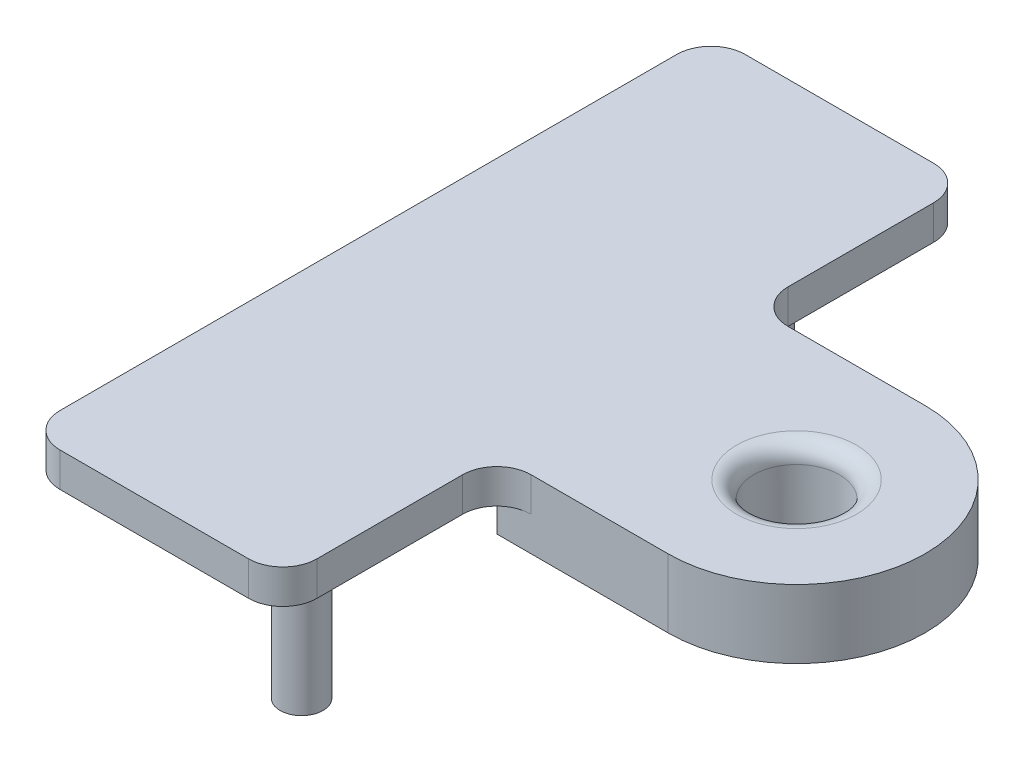
ISO-10303-21;
HEADER;
FILE_DESCRIPTION(('STEP AP214'),'2;1');
FILE_NAME('part.step','',(''),(''),'','','');
FILE_SCHEMA(('AUTOMOTIVE_DESIGN { 1 0 10303 214 1 1 1 1 }'));
ENDSEC;
DATA;
#1=APPLICATION_CONTEXT('core data for automotive mechanical design processes');
#2=APPLICATION_PROTOCOL_DEFINITION('international standard','automotive_design',2000,#1);
#3=PRODUCT_CONTEXT('',#1,'mechanical');
#4=PRODUCT('Part','Part','',(#3));
#5=PRODUCT_RELATED_PRODUCT_CATEGORY('part','',(#4));
#6=PRODUCT_DEFINITION_FORMATION('','',#4);
#7=PRODUCT_DEFINITION_CONTEXT('part definition',#1,'design');
#8=PRODUCT_DEFINITION('design','',#6,#7);
#9=PRODUCT_DEFINITION_SHAPE('','',#8);
#10=(LENGTH_UNIT() NAMED_UNIT(*) SI_UNIT(.MILLI.,.METRE.));
#11=(NAMED_UNIT(*) PLANE_ANGLE_UNIT() SI_UNIT($,.RADIAN.));
#12=(NAMED_UNIT(*) SI_UNIT($,.STERADIAN.) SOLID_ANGLE_UNIT());
#13=UNCERTAINTY_MEASURE_WITH_UNIT(LENGTH_MEASURE(1.E-05),#10,'distance_accuracy_value','');
#14=(GEOMETRIC_REPRESENTATION_CONTEXT(3) GLOBAL_UNCERTAINTY_ASSIGNED_CONTEXT((#13)) GLOBAL_UNIT_ASSIGNED_CONTEXT((#10,
#11,#12)) REPRESENTATION_CONTEXT('',''));
#15=CARTESIAN_POINT('',(0.,0.,0.));
#16=DIRECTION('',(0.,0.,1.));
#17=DIRECTION('',(1.,0.,0.));
#18=AXIS2_PLACEMENT_3D('',#15,#16,#17);
#19=CARTESIAN_POINT('',(7.5,2.,20.));
#20=DIRECTION('',(-1.,0.,0.));
#21=DIRECTION('',(0.,0.,1.));
#22=AXIS2_PLACEMENT_3D('',#19,#20,#21);
#23=PLANE('',#22);
#24=DIRECTION('',(0.,0.,-1.));
#25=VECTOR('',#24,1.);
#26=CARTESIAN_POINT('',(7.5,0.,20.));
#27=LINE('',#26,#25);
#28=CARTESIAN_POINT('',(7.5,0.,-9.5));
#29=VERTEX_POINT('',#28);
#30=CARTESIAN_POINT('',(7.5,0.,-18.));
#31=VERTEX_POINT('',#30);
#32=EDGE_CURVE('E205',#29,#31,#27,.T.);
#33=ORIENTED_EDGE('',*,*,#32,.T.);
#34=DIRECTION('',(0.,-1.,0.));
#35=VECTOR('',#34,1.);
#36=CARTESIAN_POINT('',(7.5,2.,-18.));
#37=LINE('',#36,#35);
#38=CARTESIAN_POINT('',(7.5,2.,-18.));
#39=VERTEX_POINT('',#38);
#40=EDGE_CURVE('E294',#31,#39,#37,.F.);
#41=ORIENTED_EDGE('',*,*,#40,.T.);
#42=DIRECTION('',(0.,0.,-1.));
#43=VECTOR('',#42,1.);
#44=CARTESIAN_POINT('',(7.5,2.,20.));
#45=LINE('',#44,#43);
#46=CARTESIAN_POINT('',(7.5,2.,-9.5));
#47=VERTEX_POINT('',#46);
#48=EDGE_CURVE('E212',#47,#39,#45,.T.);
#49=ORIENTED_EDGE('',*,*,#48,.F.);
#50=DIRECTION('',(0.,1.,0.));
#51=VECTOR('',#50,1.);
#52=CARTESIAN_POINT('',(7.5,2.,-9.5));
#53=LINE('',#52,#51);
#54=EDGE_CURVE('E291',#47,#29,#53,.F.);
#55=ORIENTED_EDGE('',*,*,#54,.T.);
#56=EDGE_LOOP('',(#33,#41,#49,#55));
#57=FACE_BOUND('',#56,.T.);
#58=ADVANCED_FACE('F43',(#57),#23,.F.);
#59=CARTESIAN_POINT('',(7.5,0.,18.));
#60=VERTEX_POINT('',#59);
#61=CARTESIAN_POINT('',(7.5,0.,9.5));
#62=VERTEX_POINT('',#61);
#63=EDGE_CURVE('E234',#60,#62,#27,.T.);
#64=ORIENTED_EDGE('',*,*,#63,.T.);
#65=DIRECTION('',(0.,1.,0.));
#66=VECTOR('',#65,1.);
#67=CARTESIAN_POINT('',(7.5,2.,9.5));
#68=LINE('',#67,#66);
#69=CARTESIAN_POINT('',(7.5,2.,9.5));
#70=VERTEX_POINT('',#69);
#71=EDGE_CURVE('E301',#62,#70,#68,.T.);
#72=ORIENTED_EDGE('',*,*,#71,.T.);
#73=CARTESIAN_POINT('',(7.5,2.,18.));
#74=VERTEX_POINT('',#73);
#75=EDGE_CURVE('E216',#74,#70,#45,.T.);
#76=ORIENTED_EDGE('',*,*,#75,.F.);
#77=DIRECTION('',(0.,-1.,0.));
#78=VECTOR('',#77,1.);
#79=CARTESIAN_POINT('',(7.5,2.,18.));
#80=LINE('',#79,#78);
#81=EDGE_CURVE('E297',#74,#60,#80,.T.);
#82=ORIENTED_EDGE('',*,*,#81,.T.);
#83=EDGE_LOOP('',(#64,#72,#76,#82));
#84=FACE_BOUND('',#83,.T.);
#85=ADVANCED_FACE('F355',(#84),#23,.F.);
#86=CARTESIAN_POINT('',(-7.5,2.,-20.));
#87=DIRECTION('',(0.,0.,1.));
#88=DIRECTION('',(1.,0.,0.));
#89=AXIS2_PLACEMENT_3D('',#86,#87,#88);
#90=PLANE('',#89);
#91=DIRECTION('',(-1.,0.,0.));
#92=VECTOR('',#91,1.);
#93=CARTESIAN_POINT('',(-7.5,0.,-20.));
#94=LINE('',#93,#92);
#95=CARTESIAN_POINT('',(5.5,0.,-20.));
#96=VERTEX_POINT('',#95);
#97=CARTESIAN_POINT('',(-5.5,0.,-20.));
#98=VERTEX_POINT('',#97);
#99=EDGE_CURVE('E235',#96,#98,#94,.T.);
#100=ORIENTED_EDGE('',*,*,#99,.T.);
#101=DIRECTION('',(0.,-1.,0.));
#102=VECTOR('',#101,1.);
#103=CARTESIAN_POINT('',(-5.5,2.,-20.));
#104=LINE('',#103,#102);
#105=CARTESIAN_POINT('',(-5.5,2.,-20.));
#106=VERTEX_POINT('',#105);
#107=EDGE_CURVE('E276',#98,#106,#104,.F.);
#108=ORIENTED_EDGE('',*,*,#107,.T.);
#109=DIRECTION('',(-1.,0.,0.));
#110=VECTOR('',#109,1.);
#111=CARTESIAN_POINT('',(-7.5,2.,-20.));
#112=LINE('',#111,#110);
#113=CARTESIAN_POINT('',(5.5,2.,-20.));
#114=VERTEX_POINT('',#113);
#115=EDGE_CURVE('E218',#114,#106,#112,.T.);
#116=ORIENTED_EDGE('',*,*,#115,.F.);
#117=DIRECTION('',(0.,-1.,0.));
#118=VECTOR('',#117,1.);
#119=CARTESIAN_POINT('',(5.5,2.,-20.));
#120=LINE('',#119,#118);
#121=EDGE_CURVE('E272',#114,#96,#120,.T.);
#122=ORIENTED_EDGE('',*,*,#121,.T.);
#123=EDGE_LOOP('',(#100,#108,#116,#122));
#124=FACE_BOUND('',#123,.T.);
#125=ADVANCED_FACE('F386',(#124),#90,.F.);
#126=CARTESIAN_POINT('',(-7.5,2.,20.));
#127=DIRECTION('',(1.,0.,0.));
#128=DIRECTION('',(0.,0.,-1.));
#129=AXIS2_PLACEMENT_3D('',#126,#127,#128);
#130=PLANE('',#129);
#131=DIRECTION('',(0.,0.,1.));
#132=VECTOR('',#131,1.);
#133=CARTESIAN_POINT('',(-7.5,2.,20.));
#134=LINE('',#133,#132);
#135=CARTESIAN_POINT('',(-7.5,2.,-18.));
#136=VERTEX_POINT('',#135);
#137=CARTESIAN_POINT('',(-7.5,2.,18.));
#138=VERTEX_POINT('',#137);
#139=EDGE_CURVE('E222',#136,#138,#134,.T.);
#140=ORIENTED_EDGE('',*,*,#139,.F.);
#141=DIRECTION('',(0.,-1.,0.));
#142=VECTOR('',#141,1.);
#143=CARTESIAN_POINT('',(-7.5,2.,-18.));
#144=LINE('',#143,#142);
#145=CARTESIAN_POINT('',(-7.5,0.,-18.));
#146=VERTEX_POINT('',#145);
#147=EDGE_CURVE('E256',#136,#146,#144,.T.);
#148=ORIENTED_EDGE('',*,*,#147,.T.);
#149=DIRECTION('',(0.,0.,1.));
#150=VECTOR('',#149,1.);
#151=CARTESIAN_POINT('',(-7.5,0.,20.));
#152=LINE('',#151,#150);
#153=CARTESIAN_POINT('',(-7.5,0.,18.));
#154=VERTEX_POINT('',#153);
#155=EDGE_CURVE('E239',#146,#154,#152,.T.);
#156=ORIENTED_EDGE('',*,*,#155,.T.);
#157=DIRECTION('',(0.,-1.,0.));
#158=VECTOR('',#157,1.);
#159=CARTESIAN_POINT('',(-7.5,2.,18.));
#160=LINE('',#159,#158);
#161=EDGE_CURVE('E253',#154,#138,#160,.F.);
#162=ORIENTED_EDGE('',*,*,#161,.T.);
#163=EDGE_LOOP('',(#140,#148,#156,#162));
#164=FACE_BOUND('',#163,.T.);
#165=ADVANCED_FACE('F378',(#164),#130,.F.);
#166=CARTESIAN_POINT('',(-7.5,2.,20.));
#167=DIRECTION('',(0.,0.,-1.));
#168=DIRECTION('',(-1.,0.,0.));
#169=AXIS2_PLACEMENT_3D('',#166,#167,#168);
#170=PLANE('',#169);
#171=DIRECTION('',(1.,0.,0.));
#172=VECTOR('',#171,1.);
#173=CARTESIAN_POINT('',(-7.5,0.,20.));
#174=LINE('',#173,#172);
#175=CARTESIAN_POINT('',(-5.5,0.,20.));
#176=VERTEX_POINT('',#175);
#177=CARTESIAN_POINT('',(5.5,0.,20.));
#178=VERTEX_POINT('',#177);
#179=EDGE_CURVE('E217',#176,#178,#174,.T.);
#180=ORIENTED_EDGE('',*,*,#179,.T.);
#181=DIRECTION('',(0.,-1.,0.));
#182=VECTOR('',#181,1.);
#183=CARTESIAN_POINT('',(5.5,2.,20.));
#184=LINE('',#183,#182);
#185=CARTESIAN_POINT('',(5.5,2.,20.));
#186=VERTEX_POINT('',#185);
#187=EDGE_CURVE('E322',#178,#186,#184,.F.);
#188=ORIENTED_EDGE('',*,*,#187,.T.);
#189=DIRECTION('',(1.,0.,0.));
#190=VECTOR('',#189,1.);
#191=CARTESIAN_POINT('',(-7.5,2.,20.));
#192=LINE('',#191,#190);
#193=CARTESIAN_POINT('',(-5.5,2.,20.));
#194=VERTEX_POINT('',#193);
#195=EDGE_CURVE('E226',#194,#186,#192,.T.);
#196=ORIENTED_EDGE('',*,*,#195,.F.);
#197=DIRECTION('',(0.,-1.,0.));
#198=VECTOR('',#197,1.);
#199=CARTESIAN_POINT('',(-5.5,2.,20.));
#200=LINE('',#199,#198);
#201=EDGE_CURVE('E318',#194,#176,#200,.T.);
#202=ORIENTED_EDGE('',*,*,#201,.T.);
#203=EDGE_LOOP('',(#180,#188,#196,#202));
#204=FACE_BOUND('',#203,.T.);
#205=ADVANCED_FACE('F370',(#204),#170,.F.);
#206=CARTESIAN_POINT('',(0.,2.,0.));
#207=DIRECTION('',(0.,-1.,0.));
#208=DIRECTION('',(0.,0.,-1.));
#209=AXIS2_PLACEMENT_3D('',#206,#207,#208);
#210=PLANE('',#209);
#211=CARTESIAN_POINT('',(17.5,2.,0.));
#212=DIRECTION('',(0.,-1.,0.));
#213=DIRECTION('',(0.,0.,-1.));
#214=AXIS2_PLACEMENT_3D('',#211,#212,#213);
#215=CIRCLE('',#214,3.5);
#216=CARTESIAN_POINT('',(17.5,2.,-3.5));
#217=VERTEX_POINT('',#216);
#218=EDGE_CURVE('E249',#217,#217,#215,.T.);
#219=ORIENTED_EDGE('',*,*,#218,.T.);
#220=EDGE_LOOP('',(#219));
#221=FACE_BOUND('',#220,.T.);
#222=ORIENTED_EDGE('',*,*,#115,.T.);
#223=CARTESIAN_POINT('',(-5.5,2.,-18.));
#224=DIRECTION('',(0.,-1.,0.));
#225=DIRECTION('',(0.,0.,-1.));
#226=AXIS2_PLACEMENT_3D('',#223,#224,#225);
#227=CIRCLE('',#226,2.);
#228=EDGE_CURVE('E288',#106,#136,#227,.F.);
#229=ORIENTED_EDGE('',*,*,#228,.T.);
#230=ORIENTED_EDGE('',*,*,#139,.T.);
#231=CARTESIAN_POINT('',(-5.5,2.,18.));
#232=DIRECTION('',(0.,-1.,0.));
#233=DIRECTION('',(0.,0.,-1.));
#234=AXIS2_PLACEMENT_3D('',#231,#232,#233);
#235=CIRCLE('',#234,2.);
#236=EDGE_CURVE('E279',#138,#194,#235,.F.);
#237=ORIENTED_EDGE('',*,*,#236,.T.);
#238=ORIENTED_EDGE('',*,*,#195,.T.);
#239=CARTESIAN_POINT('',(5.5,2.,18.));
#240=DIRECTION('',(0.,-1.,0.));
#241=DIRECTION('',(0.,0.,-1.));
#242=AXIS2_PLACEMENT_3D('',#239,#240,#241);
#243=CIRCLE('',#242,2.);
#244=EDGE_CURVE('E282',#186,#74,#243,.F.);
#245=ORIENTED_EDGE('',*,*,#244,.T.);
#246=ORIENTED_EDGE('',*,*,#75,.T.);
#247=CARTESIAN_POINT('',(9.5,2.,9.5));
#248=DIRECTION('',(0.,-1.,0.));
#249=DIRECTION('',(0.,0.,-1.));
#250=AXIS2_PLACEMENT_3D('',#247,#248,#249);
#251=CIRCLE('',#250,2.);
#252=CARTESIAN_POINT('',(9.5,2.,7.5));
#253=VERTEX_POINT('',#252);
#254=EDGE_CURVE('E325',#70,#253,#251,.T.);
#255=ORIENTED_EDGE('',*,*,#254,.T.);
#256=DIRECTION('',(1.,0.,0.));
#257=VECTOR('',#256,1.);
#258=CARTESIAN_POINT('',(7.5,2.,7.5));
#259=LINE('',#258,#257);
#260=CARTESIAN_POINT('',(17.5,2.,7.5));
#261=VERTEX_POINT('',#260);
#262=EDGE_CURVE('E186',#253,#261,#259,.T.);
#263=ORIENTED_EDGE('',*,*,#262,.T.);
#264=CARTESIAN_POINT('',(17.5,2.,0.));
#265=DIRECTION('',(0.,1.,0.));
#266=DIRECTION('',(0.,0.,1.));
#267=AXIS2_PLACEMENT_3D('',#264,#265,#266);
#268=CIRCLE('',#267,7.5);
#269=CARTESIAN_POINT('',(17.5,2.,-7.5));
#270=VERTEX_POINT('',#269);
#271=EDGE_CURVE('E182',#261,#270,#268,.T.);
#272=ORIENTED_EDGE('',*,*,#271,.T.);
#273=DIRECTION('',(-1.,0.,0.));
#274=VECTOR('',#273,1.);
#275=CARTESIAN_POINT('',(17.5,2.,-7.5));
#276=LINE('',#275,#274);
#277=CARTESIAN_POINT('',(9.5,2.,-7.5));
#278=VERTEX_POINT('',#277);
#279=EDGE_CURVE('E196',#270,#278,#276,.T.);
#280=ORIENTED_EDGE('',*,*,#279,.T.);
#281=CARTESIAN_POINT('',(9.5,2.,-9.5));
#282=DIRECTION('',(0.,-1.,0.));
#283=DIRECTION('',(0.,0.,-1.));
#284=AXIS2_PLACEMENT_3D('',#281,#282,#283);
#285=CIRCLE('',#284,2.);
#286=EDGE_CURVE('E52',#278,#47,#285,.T.);
#287=ORIENTED_EDGE('',*,*,#286,.T.);
#288=ORIENTED_EDGE('',*,*,#48,.T.);
#289=CARTESIAN_POINT('',(5.5,2.,-18.));
#290=DIRECTION('',(0.,-1.,0.));
#291=DIRECTION('',(0.,0.,-1.));
#292=AXIS2_PLACEMENT_3D('',#289,#290,#291);
#293=CIRCLE('',#292,2.);
#294=EDGE_CURVE('E285',#39,#114,#293,.F.);
#295=ORIENTED_EDGE('',*,*,#294,.T.);
#296=EDGE_LOOP('',(#222,#229,#230,#237,#238,#245,#246,#255,#263,#272,#280,#287,#288,#295));
#297=FACE_BOUND('',#296,.T.);
#298=ADVANCED_FACE('F333',(#221,#297),#210,.F.);
#299=CARTESIAN_POINT('',(0.,0.,0.));
#300=DIRECTION('',(0.,-1.,0.));
#301=DIRECTION('',(0.,0.,-1.));
#302=AXIS2_PLACEMENT_3D('',#299,#300,#301);
#303=PLANE('',#302);
#304=CARTESIAN_POINT('',(2.1,0.,-13.5));
#305=DIRECTION('',(0.,-1.,0.));
#306=DIRECTION('',(0.,0.,1.));
#307=AXIS2_PLACEMENT_3D('',#304,#305,#306);
#308=CIRCLE('',#307,1.25);
#309=CARTESIAN_POINT('',(2.1,0.,-12.25));
#310=VERTEX_POINT('',#309);
#311=EDGE_CURVE('E430',#310,#310,#308,.T.);
#312=ORIENTED_EDGE('',*,*,#311,.F.);
#313=EDGE_LOOP('',(#312));
#314=FACE_BOUND('',#313,.T.);
#315=CARTESIAN_POINT('',(2.1,0.,13.5));
#316=DIRECTION('',(0.,-1.,0.));
#317=DIRECTION('',(0.,0.,-1.));
#318=AXIS2_PLACEMENT_3D('',#315,#316,#317);
#319=CIRCLE('',#318,1.25);
#320=CARTESIAN_POINT('',(2.1,0.,12.25));
#321=VERTEX_POINT('',#320);
#322=EDGE_CURVE('E189',#321,#321,#319,.T.);
#323=ORIENTED_EDGE('',*,*,#322,.F.);
#324=EDGE_LOOP('',(#323));
#325=FACE_BOUND('',#324,.T.);
#326=ORIENTED_EDGE('',*,*,#155,.F.);
#327=CARTESIAN_POINT('',(-5.5,0.,-18.));
#328=DIRECTION('',(0.,-1.,0.));
#329=DIRECTION('',(0.,0.,-1.));
#330=AXIS2_PLACEMENT_3D('',#327,#328,#329);
#331=CIRCLE('',#330,2.);
#332=EDGE_CURVE('E269',#146,#98,#331,.T.);
#333=ORIENTED_EDGE('',*,*,#332,.T.);
#334=ORIENTED_EDGE('',*,*,#99,.F.);
#335=CARTESIAN_POINT('',(5.5,0.,-18.));
#336=DIRECTION('',(0.,-1.,0.));
#337=DIRECTION('',(0.,0.,-1.));
#338=AXIS2_PLACEMENT_3D('',#335,#336,#337);
#339=CIRCLE('',#338,2.);
#340=EDGE_CURVE('E266',#96,#31,#339,.T.);
#341=ORIENTED_EDGE('',*,*,#340,.T.);
#342=ORIENTED_EDGE('',*,*,#32,.F.);
#343=CARTESIAN_POINT('',(9.5,0.,-9.5));
#344=DIRECTION('',(0.,-1.,0.));
#345=DIRECTION('',(0.,0.,-1.));
#346=AXIS2_PLACEMENT_3D('',#343,#344,#345);
#347=CIRCLE('',#346,2.);
#348=CARTESIAN_POINT('',(9.5,0.,-7.5));
#349=VERTEX_POINT('',#348);
#350=EDGE_CURVE('E11',#29,#349,#347,.F.);
#351=ORIENTED_EDGE('',*,*,#350,.T.);
#352=DIRECTION('',(1.,0.,0.));
#353=VECTOR('',#352,1.);
#354=CARTESIAN_POINT('',(0.,0.,-7.5));
#355=LINE('',#354,#353);
#356=CARTESIAN_POINT('',(7.49999999999999,0.,-7.5));
#357=VERTEX_POINT('',#356);
#358=EDGE_CURVE('E58',#357,#349,#355,.T.);
#359=ORIENTED_EDGE('',*,*,#358,.F.);
#360=CARTESIAN_POINT('',(7.5,0.,7.5));
#361=VERTEX_POINT('',#360);
#362=EDGE_CURVE('E160',#361,#357,#27,.T.);
#363=ORIENTED_EDGE('',*,*,#362,.F.);
#364=DIRECTION('',(-1.,0.,0.));
#365=VECTOR('',#364,1.);
#366=CARTESIAN_POINT('',(0.,0.,7.5));
#367=LINE('',#366,#365);
#368=CARTESIAN_POINT('',(9.5,0.,7.5));
#369=VERTEX_POINT('',#368);
#370=EDGE_CURVE('E305',#369,#361,#367,.T.);
#371=ORIENTED_EDGE('',*,*,#370,.F.);
#372=CARTESIAN_POINT('',(9.5,0.,9.5));
#373=DIRECTION('',(0.,-1.,0.));
#374=DIRECTION('',(0.,0.,-1.));
#375=AXIS2_PLACEMENT_3D('',#372,#373,#374);
#376=CIRCLE('',#375,2.);
#377=EDGE_CURVE('E328',#369,#62,#376,.F.);
#378=ORIENTED_EDGE('',*,*,#377,.T.);
#379=ORIENTED_EDGE('',*,*,#63,.F.);
#380=CARTESIAN_POINT('',(5.5,0.,18.));
#381=DIRECTION('',(0.,-1.,0.));
#382=DIRECTION('',(0.,0.,-1.));
#383=AXIS2_PLACEMENT_3D('',#380,#381,#382);
#384=CIRCLE('',#383,2.);
#385=EDGE_CURVE('E263',#60,#178,#384,.T.);
#386=ORIENTED_EDGE('',*,*,#385,.T.);
#387=ORIENTED_EDGE('',*,*,#179,.F.);
#388=CARTESIAN_POINT('',(-5.5,0.,18.));
#389=DIRECTION('',(0.,-1.,0.));
#390=DIRECTION('',(0.,0.,-1.));
#391=AXIS2_PLACEMENT_3D('',#388,#389,#390);
#392=CIRCLE('',#391,2.);
#393=EDGE_CURVE('E260',#176,#154,#392,.T.);
#394=ORIENTED_EDGE('',*,*,#393,.T.);
#395=EDGE_LOOP('',(#326,#333,#334,#341,#342,#351,#359,#363,#371,#378,#379,#386,#387,#394));
#396=FACE_BOUND('',#395,.T.);
#397=ADVANCED_FACE('F348',(#314,#325,#396),#303,.T.);
#398=CARTESIAN_POINT('',(17.5,-2.,-7.5));
#399=DIRECTION('',(0.,0.,-1.));
#400=DIRECTION('',(-1.,0.,0.));
#401=AXIS2_PLACEMENT_3D('',#398,#399,#400);
#402=PLANE('',#401);
#403=ORIENTED_EDGE('',*,*,#358,.T.);
#404=DIRECTION('',(0.,1.,0.));
#405=VECTOR('',#404,1.);
#406=CARTESIAN_POINT('',(9.5,-2.,-7.5));
#407=LINE('',#406,#405);
#408=EDGE_CURVE('E314',#349,#278,#407,.T.);
#409=ORIENTED_EDGE('',*,*,#408,.T.);
#410=ORIENTED_EDGE('',*,*,#279,.F.);
#411=DIRECTION('',(0.,1.,0.));
#412=VECTOR('',#411,1.);
#413=CARTESIAN_POINT('',(17.5,-2.,-7.5));
#414=LINE('',#413,#412);
#415=CARTESIAN_POINT('',(17.5,-2.,-7.5));
#416=VERTEX_POINT('',#415);
#417=EDGE_CURVE('E180',#416,#270,#414,.T.);
#418=ORIENTED_EDGE('',*,*,#417,.F.);
#419=DIRECTION('',(-1.,0.,0.));
#420=VECTOR('',#419,1.);
#421=CARTESIAN_POINT('',(17.5,-2.,-7.5));
#422=LINE('',#421,#420);
#423=CARTESIAN_POINT('',(7.49999999999999,-2.,-7.5));
#424=VERTEX_POINT('',#423);
#425=EDGE_CURVE('E172',#416,#424,#422,.T.);
#426=ORIENTED_EDGE('',*,*,#425,.T.);
#427=DIRECTION('',(0.,1.,0.));
#428=VECTOR('',#427,1.);
#429=CARTESIAN_POINT('',(7.49999999999999,-2.,-7.5));
#430=LINE('',#429,#428);
#431=EDGE_CURVE('E155',#424,#357,#430,.T.);
#432=ORIENTED_EDGE('',*,*,#431,.T.);
#433=EDGE_LOOP('',(#403,#409,#410,#418,#426,#432));
#434=FACE_BOUND('',#433,.T.);
#435=ADVANCED_FACE('F178',(#434),#402,.T.);
#436=CARTESIAN_POINT('',(17.5,-2.,0.));
#437=DIRECTION('',(0.,1.,0.));
#438=DIRECTION('',(0.,0.,1.));
#439=AXIS2_PLACEMENT_3D('',#436,#437,#438);
#440=CYLINDRICAL_SURFACE('',#439,7.5);
#441=ORIENTED_EDGE('',*,*,#271,.F.);
#442=DIRECTION('',(0.,1.,0.));
#443=VECTOR('',#442,1.);
#444=CARTESIAN_POINT('',(17.5,-2.,7.5));
#445=LINE('',#444,#443);
#446=CARTESIAN_POINT('',(17.5,-2.,7.5));
#447=VERTEX_POINT('',#446);
#448=EDGE_CURVE('E206',#447,#261,#445,.T.);
#449=ORIENTED_EDGE('',*,*,#448,.F.);
#450=CARTESIAN_POINT('',(17.5,-2.,0.));
#451=DIRECTION('',(0.,1.,0.));
#452=DIRECTION('',(0.,0.,1.));
#453=AXIS2_PLACEMENT_3D('',#450,#451,#452);
#454=CIRCLE('',#453,7.5);
#455=EDGE_CURVE('E165',#447,#416,#454,.T.);
#456=ORIENTED_EDGE('',*,*,#455,.T.);
#457=ORIENTED_EDGE('',*,*,#417,.T.);
#458=EDGE_LOOP('',(#441,#449,#456,#457));
#459=FACE_BOUND('',#458,.T.);
#460=ADVANCED_FACE('F344',(#459),#440,.T.);
#461=CARTESIAN_POINT('',(7.5,-2.,7.5));
#462=DIRECTION('',(0.,0.,1.));
#463=DIRECTION('',(1.,0.,0.));
#464=AXIS2_PLACEMENT_3D('',#461,#462,#463);
#465=PLANE('',#464);
#466=ORIENTED_EDGE('',*,*,#262,.F.);
#467=DIRECTION('',(0.,1.,0.));
#468=VECTOR('',#467,1.);
#469=CARTESIAN_POINT('',(9.5,-2.,7.5));
#470=LINE('',#469,#468);
#471=EDGE_CURVE('E308',#253,#369,#470,.F.);
#472=ORIENTED_EDGE('',*,*,#471,.T.);
#473=ORIENTED_EDGE('',*,*,#370,.T.);
#474=DIRECTION('',(0.,1.,0.));
#475=VECTOR('',#474,1.);
#476=CARTESIAN_POINT('',(7.5,-2.,7.5));
#477=LINE('',#476,#475);
#478=CARTESIAN_POINT('',(7.5,-2.,7.5));
#479=VERTEX_POINT('',#478);
#480=EDGE_CURVE('E164',#479,#361,#477,.T.);
#481=ORIENTED_EDGE('',*,*,#480,.F.);
#482=DIRECTION('',(1.,0.,0.));
#483=VECTOR('',#482,1.);
#484=CARTESIAN_POINT('',(7.5,-2.,7.5));
#485=LINE('',#484,#483);
#486=EDGE_CURVE('E175',#479,#447,#485,.T.);
#487=ORIENTED_EDGE('',*,*,#486,.T.);
#488=ORIENTED_EDGE('',*,*,#448,.T.);
#489=EDGE_LOOP('',(#466,#472,#473,#481,#487,#488));
#490=FACE_BOUND('',#489,.T.);
#491=ADVANCED_FACE('F346',(#490),#465,.T.);
#492=CARTESIAN_POINT('',(7.49999999999999,-2.,-7.5));
#493=DIRECTION('',(-1.,0.,0.));
#494=DIRECTION('',(0.,0.,1.));
#495=AXIS2_PLACEMENT_3D('',#492,#493,#494);
#496=PLANE('',#495);
#497=ORIENTED_EDGE('',*,*,#480,.T.);
#498=ORIENTED_EDGE('',*,*,#362,.T.);
#499=ORIENTED_EDGE('',*,*,#431,.F.);
#500=DIRECTION('',(0.,0.,1.));
#501=VECTOR('',#500,1.);
#502=CARTESIAN_POINT('',(7.49999999999999,-2.,-7.5));
#503=LINE('',#502,#501);
#504=EDGE_CURVE('E159',#424,#479,#503,.T.);
#505=ORIENTED_EDGE('',*,*,#504,.T.);
#506=EDGE_LOOP('',(#497,#498,#499,#505));
#507=FACE_BOUND('',#506,.T.);
#508=ADVANCED_FACE('F158',(#507),#496,.T.);
#509=CARTESIAN_POINT('',(17.5,-2.,0.));
#510=DIRECTION('',(0.,1.,0.));
#511=DIRECTION('',(0.,0.,1.));
#512=AXIS2_PLACEMENT_3D('',#509,#510,#511);
#513=PLANE('',#512);
#514=CARTESIAN_POINT('',(17.5,-2.,0.));
#515=DIRECTION('',(0.,1.,0.));
#516=DIRECTION('',(0.,0.,1.));
#517=AXIS2_PLACEMENT_3D('',#514,#515,#516);
#518=CIRCLE('',#517,2.5);
#519=CARTESIAN_POINT('',(17.5,-2.,2.5));
#520=VERTEX_POINT('',#519);
#521=EDGE_CURVE('E423',#520,#520,#518,.F.);
#522=ORIENTED_EDGE('',*,*,#521,.F.);
#523=EDGE_LOOP('',(#522));
#524=FACE_BOUND('',#523,.T.);
#525=ORIENTED_EDGE('',*,*,#425,.F.);
#526=ORIENTED_EDGE('',*,*,#455,.F.);
#527=ORIENTED_EDGE('',*,*,#486,.F.);
#528=ORIENTED_EDGE('',*,*,#504,.F.);
#529=EDGE_LOOP('',(#525,#526,#527,#528));
#530=FACE_BOUND('',#529,.T.);
#531=ADVANCED_FACE('F170',(#524,#530),#513,.F.);
#532=CARTESIAN_POINT('',(2.1,-10.,13.5));
#533=DIRECTION('',(0.,1.,0.));
#534=DIRECTION('',(0.,0.,1.));
#535=AXIS2_PLACEMENT_3D('',#532,#533,#534);
#536=CYLINDRICAL_SURFACE('',#535,1.25);
#537=CARTESIAN_POINT('',(2.1,-10.,13.5));
#538=DIRECTION('',(0.,-1.,0.));
#539=DIRECTION('',(0.,0.,-1.));
#540=AXIS2_PLACEMENT_3D('',#537,#538,#539);
#541=CIRCLE('',#540,1.25);
#542=CARTESIAN_POINT('',(2.1,-10.,12.25));
#543=VERTEX_POINT('',#542);
#544=EDGE_CURVE('E200',#543,#543,#541,.T.);
#545=ORIENTED_EDGE('',*,*,#544,.F.);
#546=EDGE_LOOP('',(#545));
#547=FACE_BOUND('',#546,.T.);
#548=ORIENTED_EDGE('',*,*,#322,.T.);
#549=EDGE_LOOP('',(#548));
#550=FACE_BOUND('',#549,.T.);
#551=ADVANCED_FACE('F443',(#547,#550),#536,.T.);
#552=CARTESIAN_POINT('',(2.1,-10.,13.5));
#553=DIRECTION('',(0.,-1.,0.));
#554=DIRECTION('',(0.,0.,-1.));
#555=AXIS2_PLACEMENT_3D('',#552,#553,#554);
#556=PLANE('',#555);
#557=ORIENTED_EDGE('',*,*,#544,.T.);
#558=EDGE_LOOP('',(#557));
#559=FACE_BOUND('',#558,.T.);
#560=ADVANCED_FACE('F522',(#559),#556,.T.);
#561=CARTESIAN_POINT('',(2.1,-10.,-13.5));
#562=DIRECTION('',(0.,1.,0.));
#563=DIRECTION('',(0.,0.,1.));
#564=AXIS2_PLACEMENT_3D('',#561,#562,#563);
#565=CYLINDRICAL_SURFACE('',#564,1.25);
#566=CARTESIAN_POINT('',(2.1,-10.,-13.5));
#567=DIRECTION('',(0.,-1.,0.));
#568=DIRECTION('',(0.,0.,1.));
#569=AXIS2_PLACEMENT_3D('',#566,#567,#568);
#570=CIRCLE('',#569,1.25);
#571=CARTESIAN_POINT('',(2.1,-10.,-12.25));
#572=VERTEX_POINT('',#571);
#573=EDGE_CURVE('E426',#572,#572,#570,.T.);
#574=ORIENTED_EDGE('',*,*,#573,.F.);
#575=EDGE_LOOP('',(#574));
#576=FACE_BOUND('',#575,.T.);
#577=ORIENTED_EDGE('',*,*,#311,.T.);
#578=EDGE_LOOP('',(#577));
#579=FACE_BOUND('',#578,.T.);
#580=ADVANCED_FACE('F511',(#576,#579),#565,.T.);
#581=CARTESIAN_POINT('',(2.1,-10.,-13.5));
#582=DIRECTION('',(0.,1.,0.));
#583=DIRECTION('',(0.,0.,1.));
#584=AXIS2_PLACEMENT_3D('',#581,#582,#583);
#585=PLANE('',#584);
#586=ORIENTED_EDGE('',*,*,#573,.T.);
#587=EDGE_LOOP('',(#586));
#588=FACE_BOUND('',#587,.T.);
#589=ADVANCED_FACE('F414',(#588),#585,.F.);
#590=CARTESIAN_POINT('',(17.5,-10.001,0.));
#591=DIRECTION('',(0.,1.,0.));
#592=DIRECTION('',(0.,0.,1.));
#593=AXIS2_PLACEMENT_3D('',#590,#591,#592);
#594=CYLINDRICAL_SURFACE('',#593,2.5);
#595=CARTESIAN_POINT('',(17.5,1.,0.));
#596=DIRECTION('',(0.,-1.,0.));
#597=DIRECTION('',(0.,0.,-1.));
#598=AXIS2_PLACEMENT_3D('',#595,#596,#597);
#599=CIRCLE('',#598,2.5);
#600=CARTESIAN_POINT('',(17.5,1.,-2.5));
#601=VERTEX_POINT('',#600);
#602=EDGE_CURVE('E230',#601,#601,#599,.F.);
#603=ORIENTED_EDGE('',*,*,#602,.T.);
#604=EDGE_LOOP('',(#603));
#605=FACE_BOUND('',#604,.T.);
#606=ORIENTED_EDGE('',*,*,#521,.T.);
#607=EDGE_LOOP('',(#606));
#608=FACE_BOUND('',#607,.T.);
#609=ADVANCED_FACE('F409',(#605,#608),#594,.F.);
#610=CARTESIAN_POINT('',(17.5,1.,0.));
#611=DIRECTION('',(0.,-1.,0.));
#612=DIRECTION('',(0.,0.,-1.));
#613=AXIS2_PLACEMENT_3D('',#610,#611,#612);
#614=TOROIDAL_SURFACE('',#613,3.5,1.);
#615=ORIENTED_EDGE('',*,*,#218,.F.);
#616=EDGE_LOOP('',(#615));
#617=FACE_BOUND('',#616,.T.);
#618=ORIENTED_EDGE('',*,*,#602,.F.);
#619=EDGE_LOOP('',(#618));
#620=FACE_BOUND('',#619,.T.);
#621=ADVANCED_FACE('F398',(#617,#620),#614,.T.);
#622=CARTESIAN_POINT('',(-5.5,2.,-18.));
#623=DIRECTION('',(0.,-1.,0.));
#624=DIRECTION('',(0.,0.,-1.));
#625=AXIS2_PLACEMENT_3D('',#622,#623,#624);
#626=CYLINDRICAL_SURFACE('',#625,2.);
#627=ORIENTED_EDGE('',*,*,#228,.F.);
#628=ORIENTED_EDGE('',*,*,#107,.F.);
#629=ORIENTED_EDGE('',*,*,#332,.F.);
#630=ORIENTED_EDGE('',*,*,#147,.F.);
#631=EDGE_LOOP('',(#627,#628,#629,#630));
#632=FACE_BOUND('',#631,.T.);
#633=ADVANCED_FACE('F382',(#632),#626,.T.);
#634=CARTESIAN_POINT('',(5.5,2.,-18.));
#635=DIRECTION('',(0.,-1.,0.));
#636=DIRECTION('',(0.,0.,-1.));
#637=AXIS2_PLACEMENT_3D('',#634,#635,#636);
#638=CYLINDRICAL_SURFACE('',#637,2.);
#639=ORIENTED_EDGE('',*,*,#294,.F.);
#640=ORIENTED_EDGE('',*,*,#40,.F.);
#641=ORIENTED_EDGE('',*,*,#340,.F.);
#642=ORIENTED_EDGE('',*,*,#121,.F.);
#643=EDGE_LOOP('',(#639,#640,#641,#642));
#644=FACE_BOUND('',#643,.T.);
#645=ADVANCED_FACE('F390',(#644),#638,.T.);
#646=CARTESIAN_POINT('',(9.5,2.,9.5));
#647=DIRECTION('',(0.,1.,0.));
#648=DIRECTION('',(0.,0.,1.));
#649=AXIS2_PLACEMENT_3D('',#646,#647,#648);
#650=CYLINDRICAL_SURFACE('',#649,2.);
#651=ORIENTED_EDGE('',*,*,#377,.F.);
#652=ORIENTED_EDGE('',*,*,#471,.F.);
#653=ORIENTED_EDGE('',*,*,#254,.F.);
#654=ORIENTED_EDGE('',*,*,#71,.F.);
#655=EDGE_LOOP('',(#651,#652,#653,#654));
#656=FACE_BOUND('',#655,.T.);
#657=ADVANCED_FACE('F361',(#656),#650,.F.);
#658=CARTESIAN_POINT('',(9.5,-2.,-9.5));
#659=DIRECTION('',(0.,1.,0.));
#660=DIRECTION('',(0.,0.,1.));
#661=AXIS2_PLACEMENT_3D('',#658,#659,#660);
#662=CYLINDRICAL_SURFACE('',#661,2.);
#663=ORIENTED_EDGE('',*,*,#350,.F.);
#664=ORIENTED_EDGE('',*,*,#54,.F.);
#665=ORIENTED_EDGE('',*,*,#286,.F.);
#666=ORIENTED_EDGE('',*,*,#408,.F.);
#667=EDGE_LOOP('',(#663,#664,#665,#666));
#668=FACE_BOUND('',#667,.T.);
#669=ADVANCED_FACE('F340',(#668),#662,.F.);
#670=CARTESIAN_POINT('',(5.5,2.,18.));
#671=DIRECTION('',(0.,-1.,0.));
#672=DIRECTION('',(0.,0.,-1.));
#673=AXIS2_PLACEMENT_3D('',#670,#671,#672);
#674=CYLINDRICAL_SURFACE('',#673,2.);
#675=ORIENTED_EDGE('',*,*,#244,.F.);
#676=ORIENTED_EDGE('',*,*,#187,.F.);
#677=ORIENTED_EDGE('',*,*,#385,.F.);
#678=ORIENTED_EDGE('',*,*,#81,.F.);
#679=EDGE_LOOP('',(#675,#676,#677,#678));
#680=FACE_BOUND('',#679,.T.);
#681=ADVANCED_FACE('F366',(#680),#674,.T.);
#682=CARTESIAN_POINT('',(-5.5,2.,18.));
#683=DIRECTION('',(0.,-1.,0.));
#684=DIRECTION('',(0.,0.,-1.));
#685=AXIS2_PLACEMENT_3D('',#682,#683,#684);
#686=CYLINDRICAL_SURFACE('',#685,2.);
#687=ORIENTED_EDGE('',*,*,#236,.F.);
#688=ORIENTED_EDGE('',*,*,#161,.F.);
#689=ORIENTED_EDGE('',*,*,#393,.F.);
#690=ORIENTED_EDGE('',*,*,#201,.F.);
#691=EDGE_LOOP('',(#687,#688,#689,#690));
#692=FACE_BOUND('',#691,.T.);
#693=ADVANCED_FACE('F45',(#692),#686,.T.);
#694=CLOSED_SHELL('',(#58,#85,#125,#165,#205,#298,#397,#435,#460,#491,#508,#531,#551,#560,#580,
#589,#609,#621,#633,#645,#657,#669,#681,#693));
#695=MANIFOLD_SOLID_BREP('B2',#694);
#696=ADVANCED_BREP_SHAPE_REPRESENTATION('',(#18,#695),#14);
#697=SHAPE_DEFINITION_REPRESENTATION(#9,#696);
ENDSEC;
END-ISO-10303-21;
